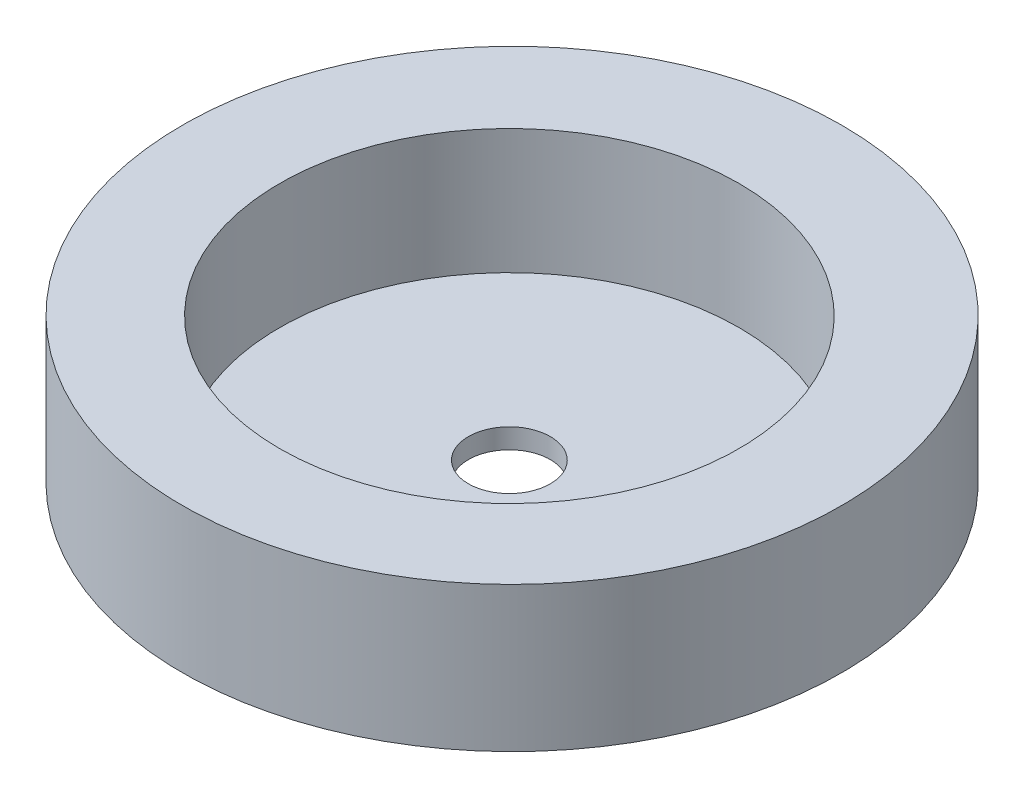
ISO-10303-21;
HEADER;
FILE_DESCRIPTION(('STEP AP214'),'2;1');
FILE_NAME('part.step','',(''),(''),'','','');
FILE_SCHEMA(('AUTOMOTIVE_DESIGN { 1 0 10303 214 1 1 1 1 }'));
ENDSEC;
DATA;
#1=APPLICATION_CONTEXT('core data for automotive mechanical design processes');
#2=APPLICATION_PROTOCOL_DEFINITION('international standard','automotive_design',2000,#1);
#3=PRODUCT_CONTEXT('',#1,'mechanical');
#4=PRODUCT('Part','Part','',(#3));
#5=PRODUCT_RELATED_PRODUCT_CATEGORY('part','',(#4));
#6=PRODUCT_DEFINITION_FORMATION('','',#4);
#7=PRODUCT_DEFINITION_CONTEXT('part definition',#1,'design');
#8=PRODUCT_DEFINITION('design','',#6,#7);
#9=PRODUCT_DEFINITION_SHAPE('','',#8);
#10=(LENGTH_UNIT() NAMED_UNIT(*) SI_UNIT(.MILLI.,.METRE.));
#11=(NAMED_UNIT(*) PLANE_ANGLE_UNIT() SI_UNIT($,.RADIAN.));
#12=(NAMED_UNIT(*) SI_UNIT($,.STERADIAN.) SOLID_ANGLE_UNIT());
#13=UNCERTAINTY_MEASURE_WITH_UNIT(LENGTH_MEASURE(1.E-05),#10,'distance_accuracy_value','');
#14=(GEOMETRIC_REPRESENTATION_CONTEXT(3) GLOBAL_UNCERTAINTY_ASSIGNED_CONTEXT((#13)) GLOBAL_UNIT_ASSIGNED_CONTEXT((#10,
#11,#12)) REPRESENTATION_CONTEXT('',''));
#15=CARTESIAN_POINT('',(0.,0.,0.));
#16=DIRECTION('',(0.,0.,1.));
#17=DIRECTION('',(1.,0.,0.));
#18=AXIS2_PLACEMENT_3D('',#15,#16,#17);
#19=CARTESIAN_POINT('',(-11.112077011578,0.,-20.9007097057315));
#20=DIRECTION('',(0.,1.,0.));
#21=DIRECTION('',(0.,0.,1.));
#22=AXIS2_PLACEMENT_3D('',#19,#20,#21);
#23=CYLINDRICAL_SURFACE('',#22,2.05);
#24=CARTESIAN_POINT('',(-11.112077011578,0.,-20.9007097057315));
#25=DIRECTION('',(0.,1.,0.));
#26=DIRECTION('',(0.,0.,1.));
#27=AXIS2_PLACEMENT_3D('',#24,#25,#26);
#28=CIRCLE('',#27,2.05);
#29=CARTESIAN_POINT('',(-11.112077011578,0.,-18.8507097057315));
#30=VERTEX_POINT('',#29);
#31=EDGE_CURVE('E50',#30,#30,#28,.T.);
#32=CARTESIAN_POINT('',(-11.112077011578,1.,-20.9007097057315));
#33=DIRECTION('',(0.,1.,0.));
#34=DIRECTION('',(0.,0.,1.));
#35=AXIS2_PLACEMENT_3D('',#32,#33,#34);
#36=CIRCLE('',#35,2.05);
#37=CARTESIAN_POINT('',(-11.112077011578,1.,-18.8507097057315));
#38=VERTEX_POINT('',#37);
#39=EDGE_CURVE('E41',#38,#38,#36,.F.);
#40=CARTESIAN_POINT('',(-11.112077011578,0.,-18.8507097057315));
#41=CARTESIAN_POINT('',(-11.112077011578,0.0104166666666667,-18.8507097057315));
#42=CARTESIAN_POINT('',(-11.112077011578,0.0208333333333333,-18.8507097057315));
#43=CARTESIAN_POINT('',(-11.112077011578,0.0416666666666667,-18.8507097057315));
#44=CARTESIAN_POINT('',(-11.112077011578,0.0520833333333333,-18.8507097057315));
#45=CARTESIAN_POINT('',(-11.112077011578,0.0729166666666667,-18.8507097057315));
#46=CARTESIAN_POINT('',(-11.112077011578,0.0833333333333333,-18.8507097057315));
#47=CARTESIAN_POINT('',(-11.112077011578,0.104166666666667,-18.8507097057315));
#48=CARTESIAN_POINT('',(-11.112077011578,0.114583333333333,-18.8507097057315));
#49=CARTESIAN_POINT('',(-11.112077011578,0.135416666666667,-18.8507097057315));
#50=CARTESIAN_POINT('',(-11.112077011578,0.145833333333333,-18.8507097057315));
#51=CARTESIAN_POINT('',(-11.112077011578,0.166666666666667,-18.8507097057315));
#52=CARTESIAN_POINT('',(-11.112077011578,0.177083333333333,-18.8507097057315));
#53=CARTESIAN_POINT('',(-11.112077011578,0.197916666666667,-18.8507097057315));
#54=CARTESIAN_POINT('',(-11.112077011578,0.208333333333333,-18.8507097057315));
#55=CARTESIAN_POINT('',(-11.112077011578,0.229166666666667,-18.8507097057315));
#56=CARTESIAN_POINT('',(-11.112077011578,0.239583333333333,-18.8507097057315));
#57=CARTESIAN_POINT('',(-11.112077011578,0.260416666666667,-18.8507097057315));
#58=CARTESIAN_POINT('',(-11.112077011578,0.270833333333333,-18.8507097057315));
#59=CARTESIAN_POINT('',(-11.112077011578,0.291666666666667,-18.8507097057315));
#60=CARTESIAN_POINT('',(-11.112077011578,0.302083333333333,-18.8507097057315));
#61=CARTESIAN_POINT('',(-11.112077011578,0.322916666666667,-18.8507097057315));
#62=CARTESIAN_POINT('',(-11.112077011578,0.333333333333333,-18.8507097057315));
#63=CARTESIAN_POINT('',(-11.112077011578,0.354166666666667,-18.8507097057315));
#64=CARTESIAN_POINT('',(-11.112077011578,0.364583333333333,-18.8507097057315));
#65=CARTESIAN_POINT('',(-11.112077011578,0.385416666666667,-18.8507097057315));
#66=CARTESIAN_POINT('',(-11.112077011578,0.395833333333333,-18.8507097057315));
#67=CARTESIAN_POINT('',(-11.112077011578,0.416666666666667,-18.8507097057315));
#68=CARTESIAN_POINT('',(-11.112077011578,0.427083333333333,-18.8507097057315));
#69=CARTESIAN_POINT('',(-11.112077011578,0.447916666666667,-18.8507097057315));
#70=CARTESIAN_POINT('',(-11.112077011578,0.458333333333333,-18.8507097057315));
#71=CARTESIAN_POINT('',(-11.112077011578,0.479166666666667,-18.8507097057315));
#72=CARTESIAN_POINT('',(-11.112077011578,0.489583333333333,-18.8507097057315));
#73=CARTESIAN_POINT('',(-11.112077011578,0.510416666666667,-18.8507097057315));
#74=CARTESIAN_POINT('',(-11.112077011578,0.520833333333333,-18.8507097057315));
#75=CARTESIAN_POINT('',(-11.112077011578,0.541666666666667,-18.8507097057315));
#76=CARTESIAN_POINT('',(-11.112077011578,0.552083333333333,-18.8507097057315));
#77=CARTESIAN_POINT('',(-11.112077011578,0.572916666666667,-18.8507097057315));
#78=CARTESIAN_POINT('',(-11.112077011578,0.583333333333333,-18.8507097057315));
#79=CARTESIAN_POINT('',(-11.112077011578,0.604166666666667,-18.8507097057315));
#80=CARTESIAN_POINT('',(-11.112077011578,0.614583333333333,-18.8507097057315));
#81=CARTESIAN_POINT('',(-11.112077011578,0.635416666666667,-18.8507097057315));
#82=CARTESIAN_POINT('',(-11.112077011578,0.645833333333333,-18.8507097057315));
#83=CARTESIAN_POINT('',(-11.112077011578,0.666666666666667,-18.8507097057315));
#84=CARTESIAN_POINT('',(-11.112077011578,0.677083333333333,-18.8507097057315));
#85=CARTESIAN_POINT('',(-11.112077011578,0.697916666666667,-18.8507097057315));
#86=CARTESIAN_POINT('',(-11.112077011578,0.708333333333333,-18.8507097057315));
#87=CARTESIAN_POINT('',(-11.112077011578,0.729166666666667,-18.8507097057315));
#88=CARTESIAN_POINT('',(-11.112077011578,0.739583333333333,-18.8507097057315));
#89=CARTESIAN_POINT('',(-11.112077011578,0.760416666666667,-18.8507097057315));
#90=CARTESIAN_POINT('',(-11.112077011578,0.770833333333333,-18.8507097057315));
#91=CARTESIAN_POINT('',(-11.112077011578,0.791666666666667,-18.8507097057315));
#92=CARTESIAN_POINT('',(-11.112077011578,0.802083333333333,-18.8507097057315));
#93=CARTESIAN_POINT('',(-11.112077011578,0.822916666666667,-18.8507097057315));
#94=CARTESIAN_POINT('',(-11.112077011578,0.833333333333333,-18.8507097057315));
#95=CARTESIAN_POINT('',(-11.112077011578,0.854166666666667,-18.8507097057315));
#96=CARTESIAN_POINT('',(-11.112077011578,0.864583333333333,-18.8507097057315));
#97=CARTESIAN_POINT('',(-11.112077011578,0.885416666666667,-18.8507097057315));
#98=CARTESIAN_POINT('',(-11.112077011578,0.895833333333333,-18.8507097057315));
#99=CARTESIAN_POINT('',(-11.112077011578,0.916666666666667,-18.8507097057315));
#100=CARTESIAN_POINT('',(-11.112077011578,0.927083333333333,-18.8507097057315));
#101=CARTESIAN_POINT('',(-11.112077011578,0.947916666666667,-18.8507097057315));
#102=CARTESIAN_POINT('',(-11.112077011578,0.958333333333333,-18.8507097057315));
#103=CARTESIAN_POINT('',(-11.112077011578,0.979166666666667,-18.8507097057315));
#104=CARTESIAN_POINT('',(-11.112077011578,0.989583333333333,-18.8507097057315));
#105=CARTESIAN_POINT('',(-11.112077011578,1.,-18.8507097057315));
#106=B_SPLINE_CURVE_WITH_KNOTS('',3,(#40,#41,#42,#43,#44,#45,#46,#47,#48,#49,#50,#51,#52,#53,
#54,#55,#56,#57,#58,#59,#60,#61,#62,#63,#64,#65,#66,#67,#68,#69,#70,#71,#72,#73,#74,#75,#76,#77,
#78,#79,#80,#81,#82,#83,#84,#85,#86,#87,#88,#89,#90,#91,#92,#93,#94,#95,#96,#97,#98,#99,#100,
#101,#102,#103,#104,#105),.UNSPECIFIED.,.F.,.F.,(4,2,2,2,2,2,2,2,2,2,2,2,2,2,2,2,2,2,2,2,2,2,2,
2,2,2,2,2,2,2,2,2,4),(0.,0.03125,0.0625,0.09375,0.125,0.15625,0.1875,0.21875,0.25,0.28125,
0.3125,0.34375,0.375,0.40625,0.4375,0.46875,0.5,0.53125,0.5625,0.59375,0.625,0.65625,0.6875,
0.71875,0.75,0.78125,0.8125,0.84375,0.875,0.90625,0.9375,0.96875,1.),.UNSPECIFIED.);
#107=EDGE_CURVE('BSEAM37',#30,#38,#106,.T.);
#108=ORIENTED_EDGE('',*,*,#31,.F.);
#109=ORIENTED_EDGE('',*,*,#39,.F.);
#110=ORIENTED_EDGE('',*,*,#107,.T.);
#111=ORIENTED_EDGE('',*,*,#107,.F.);
#112=EDGE_LOOP('',(#108,#110,#109,#111));
#113=FACE_BOUND('',#112,.T.);
#114=ADVANCED_FACE('F37',(#113),#23,.F.);
#115=CARTESIAN_POINT('',(-11.0733382765573,7.25,-20.9975565432832));
#116=DIRECTION('',(0.,-1.,0.));
#117=DIRECTION('',(0.,0.,-1.));
#118=AXIS2_PLACEMENT_3D('',#115,#116,#117);
#119=CYLINDRICAL_SURFACE('',#118,16.5);
#120=CARTESIAN_POINT('',(-11.0733382765573,7.25,-20.9975565432832));
#121=DIRECTION('',(0.,1.,0.));
#122=DIRECTION('',(0.,0.,1.));
#123=AXIS2_PLACEMENT_3D('',#120,#121,#122);
#124=CIRCLE('',#123,16.5);
#125=CARTESIAN_POINT('',(-11.0733382765573,7.25,-37.4975565432832));
#126=VERTEX_POINT('',#125);
#127=EDGE_CURVE('E10',#126,#126,#124,.T.);
#128=CARTESIAN_POINT('',(-11.0733382765573,0.,-20.9975565432832));
#129=DIRECTION('',(0.,1.,0.));
#130=DIRECTION('',(0.,0.,1.));
#131=AXIS2_PLACEMENT_3D('',#128,#129,#130);
#132=CIRCLE('',#131,16.5);
#133=CARTESIAN_POINT('',(-11.0733382765573,0.,-37.4975565432832));
#134=VERTEX_POINT('',#133);
#135=EDGE_CURVE('E45',#134,#134,#132,.T.);
#136=CARTESIAN_POINT('',(-11.0733382765573,7.25,-37.4975565432832));
#137=CARTESIAN_POINT('',(-11.0733382765573,7.17447916666667,-37.4975565432832));
#138=CARTESIAN_POINT('',(-11.0733382765573,7.09895833333333,-37.4975565432832));
#139=CARTESIAN_POINT('',(-11.0733382765573,6.94791666666667,-37.4975565432832));
#140=CARTESIAN_POINT('',(-11.0733382765573,6.87239583333333,-37.4975565432832));
#141=CARTESIAN_POINT('',(-11.0733382765573,6.72135416666667,-37.4975565432832));
#142=CARTESIAN_POINT('',(-11.0733382765573,6.64583333333333,-37.4975565432832));
#143=CARTESIAN_POINT('',(-11.0733382765573,6.49479166666667,-37.4975565432832));
#144=CARTESIAN_POINT('',(-11.0733382765573,6.41927083333333,-37.4975565432832));
#145=CARTESIAN_POINT('',(-11.0733382765573,6.26822916666667,-37.4975565432832));
#146=CARTESIAN_POINT('',(-11.0733382765573,6.19270833333333,-37.4975565432832));
#147=CARTESIAN_POINT('',(-11.0733382765573,6.04166666666667,-37.4975565432832));
#148=CARTESIAN_POINT('',(-11.0733382765573,5.96614583333333,-37.4975565432832));
#149=CARTESIAN_POINT('',(-11.0733382765573,5.81510416666667,-37.4975565432832));
#150=CARTESIAN_POINT('',(-11.0733382765573,5.73958333333333,-37.4975565432832));
#151=CARTESIAN_POINT('',(-11.0733382765573,5.58854166666667,-37.4975565432832));
#152=CARTESIAN_POINT('',(-11.0733382765573,5.51302083333333,-37.4975565432832));
#153=CARTESIAN_POINT('',(-11.0733382765573,5.36197916666667,-37.4975565432832));
#154=CARTESIAN_POINT('',(-11.0733382765573,5.28645833333333,-37.4975565432832));
#155=CARTESIAN_POINT('',(-11.0733382765573,5.13541666666667,-37.4975565432832));
#156=CARTESIAN_POINT('',(-11.0733382765573,5.05989583333333,-37.4975565432832));
#157=CARTESIAN_POINT('',(-11.0733382765573,4.90885416666667,-37.4975565432832));
#158=CARTESIAN_POINT('',(-11.0733382765573,4.83333333333333,-37.4975565432832));
#159=CARTESIAN_POINT('',(-11.0733382765573,4.68229166666667,-37.4975565432832));
#160=CARTESIAN_POINT('',(-11.0733382765573,4.60677083333333,-37.4975565432832));
#161=CARTESIAN_POINT('',(-11.0733382765573,4.45572916666667,-37.4975565432832));
#162=CARTESIAN_POINT('',(-11.0733382765573,4.38020833333333,-37.4975565432832));
#163=CARTESIAN_POINT('',(-11.0733382765573,4.22916666666667,-37.4975565432832));
#164=CARTESIAN_POINT('',(-11.0733382765573,4.15364583333333,-37.4975565432832));
#165=CARTESIAN_POINT('',(-11.0733382765573,4.00260416666667,-37.4975565432832));
#166=CARTESIAN_POINT('',(-11.0733382765573,3.92708333333333,-37.4975565432832));
#167=CARTESIAN_POINT('',(-11.0733382765573,3.77604166666667,-37.4975565432832));
#168=CARTESIAN_POINT('',(-11.0733382765573,3.70052083333333,-37.4975565432832));
#169=CARTESIAN_POINT('',(-11.0733382765573,3.54947916666667,-37.4975565432832));
#170=CARTESIAN_POINT('',(-11.0733382765573,3.47395833333333,-37.4975565432832));
#171=CARTESIAN_POINT('',(-11.0733382765573,3.32291666666667,-37.4975565432832));
#172=CARTESIAN_POINT('',(-11.0733382765573,3.24739583333333,-37.4975565432832));
#173=CARTESIAN_POINT('',(-11.0733382765573,3.09635416666667,-37.4975565432832));
#174=CARTESIAN_POINT('',(-11.0733382765573,3.02083333333333,-37.4975565432832));
#175=CARTESIAN_POINT('',(-11.0733382765573,2.86979166666667,-37.4975565432832));
#176=CARTESIAN_POINT('',(-11.0733382765573,2.79427083333333,-37.4975565432832));
#177=CARTESIAN_POINT('',(-11.0733382765573,2.64322916666667,-37.4975565432832));
#178=CARTESIAN_POINT('',(-11.0733382765573,2.56770833333333,-37.4975565432832));
#179=CARTESIAN_POINT('',(-11.0733382765573,2.41666666666667,-37.4975565432832));
#180=CARTESIAN_POINT('',(-11.0733382765573,2.34114583333333,-37.4975565432832));
#181=CARTESIAN_POINT('',(-11.0733382765573,2.19010416666667,-37.4975565432832));
#182=CARTESIAN_POINT('',(-11.0733382765573,2.11458333333333,-37.4975565432832));
#183=CARTESIAN_POINT('',(-11.0733382765573,1.96354166666667,-37.4975565432832));
#184=CARTESIAN_POINT('',(-11.0733382765573,1.88802083333333,-37.4975565432832));
#185=CARTESIAN_POINT('',(-11.0733382765573,1.73697916666667,-37.4975565432832));
#186=CARTESIAN_POINT('',(-11.0733382765573,1.66145833333333,-37.4975565432832));
#187=CARTESIAN_POINT('',(-11.0733382765573,1.51041666666667,-37.4975565432832));
#188=CARTESIAN_POINT('',(-11.0733382765573,1.43489583333333,-37.4975565432832));
#189=CARTESIAN_POINT('',(-11.0733382765573,1.28385416666667,-37.4975565432832));
#190=CARTESIAN_POINT('',(-11.0733382765573,1.20833333333333,-37.4975565432832));
#191=CARTESIAN_POINT('',(-11.0733382765573,1.05729166666667,-37.4975565432832));
#192=CARTESIAN_POINT('',(-11.0733382765573,0.981770833333333,-37.4975565432832));
#193=CARTESIAN_POINT('',(-11.0733382765573,0.830729166666667,-37.4975565432832));
#194=CARTESIAN_POINT('',(-11.0733382765573,0.755208333333333,-37.4975565432832));
#195=CARTESIAN_POINT('',(-11.0733382765573,0.604166666666667,-37.4975565432832));
#196=CARTESIAN_POINT('',(-11.0733382765573,0.528645833333333,-37.4975565432832));
#197=CARTESIAN_POINT('',(-11.0733382765573,0.377604166666667,-37.4975565432832));
#198=CARTESIAN_POINT('',(-11.0733382765573,0.302083333333334,-37.4975565432832));
#199=CARTESIAN_POINT('',(-11.0733382765573,0.151041666666667,-37.4975565432832));
#200=CARTESIAN_POINT('',(-11.0733382765573,0.0755208333333333,-37.4975565432832));
#201=CARTESIAN_POINT('',(-11.0733382765573,0.,-37.4975565432832));
#202=B_SPLINE_CURVE_WITH_KNOTS('',3,(#136,#137,#138,#139,#140,#141,#142,#143,#144,#145,#146,
#147,#148,#149,#150,#151,#152,#153,#154,#155,#156,#157,#158,#159,#160,#161,#162,#163,#164,#165,
#166,#167,#168,#169,#170,#171,#172,#173,#174,#175,#176,#177,#178,#179,#180,#181,#182,#183,#184,
#185,#186,#187,#188,#189,#190,#191,#192,#193,#194,#195,#196,#197,#198,#199,#200,#201),
.UNSPECIFIED.,.F.,.F.,(4,2,2,2,2,2,2,2,2,2,2,2,2,2,2,2,2,2,2,2,2,2,2,2,2,2,2,2,2,2,2,2,4),(0.,
0.2265625,0.453125,0.679687500000001,0.906250000000001,1.1328125,1.359375,1.5859375,1.8125,
2.0390625,2.265625,2.4921875,2.71875,2.9453125,3.171875,3.3984375,3.625,3.8515625,4.078125,
4.3046875,4.53125,4.7578125,4.984375,5.2109375,5.4375,5.6640625,5.890625,6.1171875,6.34375,
6.5703125,6.796875,7.0234375,7.25),.UNSPECIFIED.);
#203=EDGE_CURVE('BSEAM39',#126,#134,#202,.T.);
#204=ORIENTED_EDGE('',*,*,#127,.F.);
#205=ORIENTED_EDGE('',*,*,#135,.T.);
#206=ORIENTED_EDGE('',*,*,#203,.T.);
#207=ORIENTED_EDGE('',*,*,#203,.F.);
#208=EDGE_LOOP('',(#204,#206,#205,#207));
#209=FACE_BOUND('',#208,.T.);
#210=ADVANCED_FACE('F39',(#209),#119,.T.);
#211=CARTESIAN_POINT('',(-11.0733382765573,7.25,-20.9975565432832));
#212=DIRECTION('',(0.,1.,0.));
#213=DIRECTION('',(0.,0.,1.));
#214=AXIS2_PLACEMENT_3D('',#211,#212,#213);
#215=PLANE('',#214);
#216=CARTESIAN_POINT('',(-11.112077011578,7.25,-20.9007097057315));
#217=DIRECTION('',(0.,1.,0.));
#218=DIRECTION('',(0.,0.,1.));
#219=AXIS2_PLACEMENT_3D('',#216,#217,#218);
#220=CIRCLE('',#219,11.5);
#221=CARTESIAN_POINT('',(-11.112077011578,7.25,-9.4007097057315));
#222=VERTEX_POINT('',#221);
#223=EDGE_CURVE('E54',#222,#222,#220,.T.);
#224=ORIENTED_EDGE('',*,*,#223,.F.);
#225=EDGE_LOOP('',(#224));
#226=FACE_BOUND('',#225,.T.);
#227=ORIENTED_EDGE('',*,*,#127,.T.);
#228=EDGE_LOOP('',(#227));
#229=FACE_BOUND('',#228,.T.);
#230=ADVANCED_FACE('F72',(#226,#229),#215,.T.);
#231=CARTESIAN_POINT('',(-11.0733382765573,0.,-20.9975565432832));
#232=DIRECTION('',(0.,1.,0.));
#233=DIRECTION('',(0.,0.,1.));
#234=AXIS2_PLACEMENT_3D('',#231,#232,#233);
#235=PLANE('',#234);
#236=ORIENTED_EDGE('',*,*,#31,.T.);
#237=EDGE_LOOP('',(#236));
#238=FACE_BOUND('',#237,.T.);
#239=ORIENTED_EDGE('',*,*,#135,.F.);
#240=EDGE_LOOP('',(#239));
#241=FACE_BOUND('',#240,.T.);
#242=ADVANCED_FACE('F80',(#238,#241),#235,.F.);
#243=CARTESIAN_POINT('',(-11.112077011578,1.,-20.9007097057315));
#244=DIRECTION('',(0.,1.,0.));
#245=DIRECTION('',(0.,0.,1.));
#246=AXIS2_PLACEMENT_3D('',#243,#244,#245);
#247=PLANE('',#246);
#248=CARTESIAN_POINT('',(-11.112077011578,1.,-20.9007097057315));
#249=DIRECTION('',(0.,1.,0.));
#250=DIRECTION('',(0.,0.,1.));
#251=AXIS2_PLACEMENT_3D('',#248,#249,#250);
#252=CIRCLE('',#251,11.5);
#253=CARTESIAN_POINT('',(-11.112077011578,1.,-9.4007097057315));
#254=VERTEX_POINT('',#253);
#255=EDGE_CURVE('E57',#254,#254,#252,.T.);
#256=ORIENTED_EDGE('',*,*,#255,.T.);
#257=EDGE_LOOP('',(#256));
#258=FACE_BOUND('',#257,.T.);
#259=ORIENTED_EDGE('',*,*,#39,.T.);
#260=EDGE_LOOP('',(#259));
#261=FACE_BOUND('',#260,.T.);
#262=ADVANCED_FACE('F64',(#258,#261),#247,.T.);
#263=CARTESIAN_POINT('',(-11.112077011578,1.,-20.9007097057315));
#264=DIRECTION('',(0.,1.,0.));
#265=DIRECTION('',(0.,0.,1.));
#266=AXIS2_PLACEMENT_3D('',#263,#264,#265);
#267=CYLINDRICAL_SURFACE('',#266,11.5);
#268=ORIENTED_EDGE('',*,*,#255,.F.);
#269=EDGE_LOOP('',(#268));
#270=FACE_BOUND('',#269,.T.);
#271=ORIENTED_EDGE('',*,*,#223,.T.);
#272=EDGE_LOOP('',(#271));
#273=FACE_BOUND('',#272,.T.);
#274=ADVANCED_FACE('F77',(#270,#273),#267,.F.);
#275=CLOSED_SHELL('',(#114,#210,#230,#242,#262,#274));
#276=MANIFOLD_SOLID_BREP('B2',#275);
#277=ADVANCED_BREP_SHAPE_REPRESENTATION('',(#18,#276),#14);
#278=SHAPE_DEFINITION_REPRESENTATION(#9,#277);
ENDSEC;
END-ISO-10303-21;
